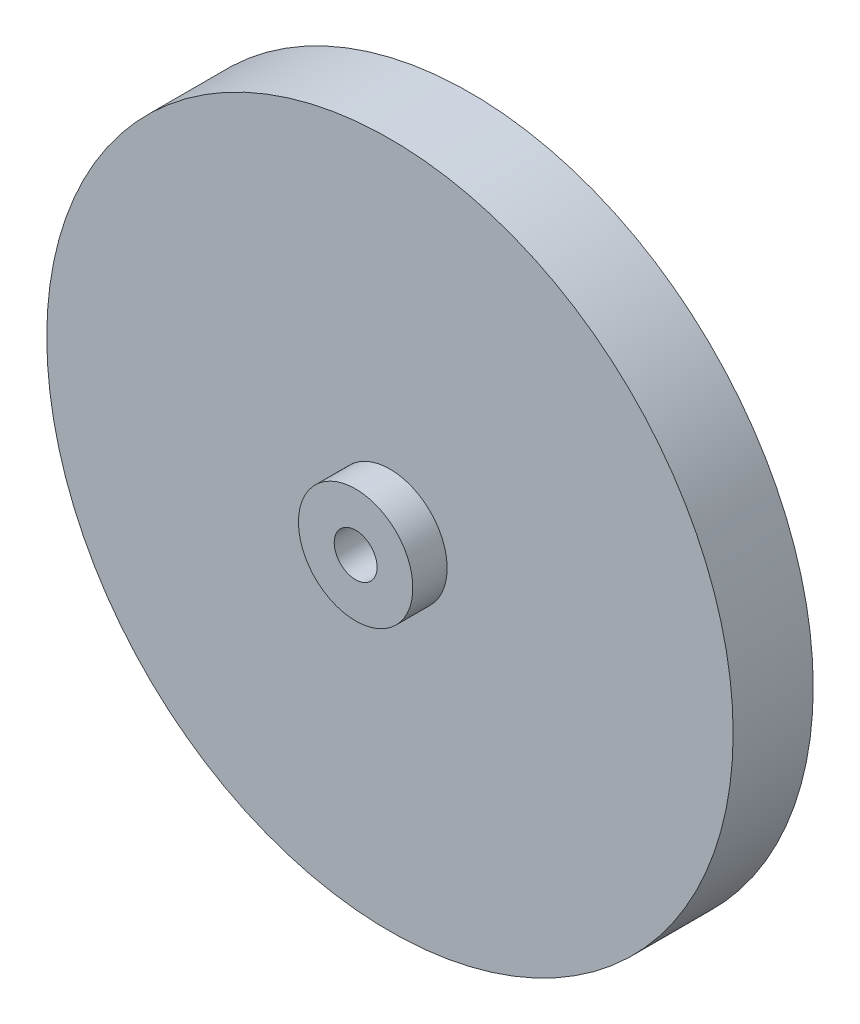
ISO-10303-21;
HEADER;
FILE_DESCRIPTION(('STEP AP214'),'2;1');
FILE_NAME('part.step','',(''),(''),'','','');
FILE_SCHEMA(('AUTOMOTIVE_DESIGN { 1 0 10303 214 1 1 1 1 }'));
ENDSEC;
DATA;
#1=APPLICATION_CONTEXT('core data for automotive mechanical design processes');
#2=APPLICATION_PROTOCOL_DEFINITION('international standard','automotive_design',2000,#1);
#3=PRODUCT_CONTEXT('',#1,'mechanical');
#4=PRODUCT('Part','Part','',(#3));
#5=PRODUCT_RELATED_PRODUCT_CATEGORY('part','',(#4));
#6=PRODUCT_DEFINITION_FORMATION('','',#4);
#7=PRODUCT_DEFINITION_CONTEXT('part definition',#1,'design');
#8=PRODUCT_DEFINITION('design','',#6,#7);
#9=PRODUCT_DEFINITION_SHAPE('','',#8);
#10=(LENGTH_UNIT() NAMED_UNIT(*) SI_UNIT(.MILLI.,.METRE.));
#11=(NAMED_UNIT(*) PLANE_ANGLE_UNIT() SI_UNIT($,.RADIAN.));
#12=(NAMED_UNIT(*) SI_UNIT($,.STERADIAN.) SOLID_ANGLE_UNIT());
#13=UNCERTAINTY_MEASURE_WITH_UNIT(LENGTH_MEASURE(1.E-05),#10,'distance_accuracy_value','');
#14=(GEOMETRIC_REPRESENTATION_CONTEXT(3) GLOBAL_UNCERTAINTY_ASSIGNED_CONTEXT((#13)) GLOBAL_UNIT_ASSIGNED_CONTEXT((#10,
#11,#12)) REPRESENTATION_CONTEXT('',''));
#15=CARTESIAN_POINT('',(0.,0.,0.));
#16=DIRECTION('',(0.,0.,1.));
#17=DIRECTION('',(1.,0.,0.));
#18=AXIS2_PLACEMENT_3D('',#15,#16,#17);
#19=CARTESIAN_POINT('',(0.,0.,-56.2011494252873));
#20=DIRECTION('',(0.,0.,-1.));
#21=DIRECTION('',(-1.,0.,0.));
#22=AXIS2_PLACEMENT_3D('',#19,#20,#21);
#23=CYLINDRICAL_SURFACE('',#22,60.);
#24=CARTESIAN_POINT('',(0.,0.,-26.4948275862069));
#25=DIRECTION('',(0.,0.,-1.));
#26=DIRECTION('',(-1.,0.,0.));
#27=AXIS2_PLACEMENT_3D('',#24,#25,#26);
#28=CIRCLE('',#27,60.);
#29=CARTESIAN_POINT('',(-60.,0.,-26.4948275862069));
#30=VERTEX_POINT('',#29);
#31=EDGE_CURVE('E37',#30,#30,#28,.T.);
#32=ORIENTED_EDGE('',*,*,#31,.T.);
#33=EDGE_LOOP('',(#32));
#34=FACE_BOUND('',#33,.T.);
#35=CARTESIAN_POINT('',(0.,0.,-40.4948275862069));
#36=DIRECTION('',(0.,0.,-1.));
#37=DIRECTION('',(-1.,0.,0.));
#38=AXIS2_PLACEMENT_3D('',#35,#36,#37);
#39=CIRCLE('',#38,60.);
#40=CARTESIAN_POINT('',(-60.,0.,-40.4948275862069));
#41=VERTEX_POINT('',#40);
#42=EDGE_CURVE('E10',#41,#41,#39,.T.);
#43=ORIENTED_EDGE('',*,*,#42,.F.);
#44=EDGE_LOOP('',(#43));
#45=FACE_BOUND('',#44,.T.);
#46=ADVANCED_FACE('F31',(#34,#45),#23,.T.);
#47=CARTESIAN_POINT('',(-60.,0.,-26.4948275862069));
#48=DIRECTION('',(0.,0.,1.));
#49=DIRECTION('',(1.,0.,0.));
#50=AXIS2_PLACEMENT_3D('',#47,#48,#49);
#51=PLANE('',#50);
#52=CARTESIAN_POINT('',(0.,0.,-26.4948275862069));
#53=DIRECTION('',(0.,0.,-1.));
#54=DIRECTION('',(-1.,0.,0.));
#55=AXIS2_PLACEMENT_3D('',#52,#53,#54);
#56=CIRCLE('',#55,10.);
#57=CARTESIAN_POINT('',(-10.,0.,-26.4948275862069));
#58=VERTEX_POINT('',#57);
#59=EDGE_CURVE('E41',#58,#58,#56,.T.);
#60=ORIENTED_EDGE('',*,*,#59,.T.);
#61=EDGE_LOOP('',(#60));
#62=FACE_BOUND('',#61,.T.);
#63=ORIENTED_EDGE('',*,*,#31,.F.);
#64=EDGE_LOOP('',(#63));
#65=FACE_BOUND('',#64,.T.);
#66=ADVANCED_FACE('F69',(#62,#65),#51,.T.);
#67=CARTESIAN_POINT('',(0.,0.,-56.2011494252873));
#68=DIRECTION('',(0.,0.,-1.));
#69=DIRECTION('',(-1.,0.,0.));
#70=AXIS2_PLACEMENT_3D('',#67,#68,#69);
#71=CYLINDRICAL_SURFACE('',#70,9.99999999999999);
#72=CARTESIAN_POINT('',(0.,0.,-20.4948275862069));
#73=DIRECTION('',(0.,0.,-1.));
#74=DIRECTION('',(-1.,0.,0.));
#75=AXIS2_PLACEMENT_3D('',#72,#73,#74);
#76=CIRCLE('',#75,9.99999999999999);
#77=CARTESIAN_POINT('',(-9.99999999999999,0.,-20.4948275862069));
#78=VERTEX_POINT('',#77);
#79=EDGE_CURVE('E45',#78,#78,#76,.T.);
#80=ORIENTED_EDGE('',*,*,#79,.T.);
#81=EDGE_LOOP('',(#80));
#82=FACE_BOUND('',#81,.T.);
#83=ORIENTED_EDGE('',*,*,#59,.F.);
#84=EDGE_LOOP('',(#83));
#85=FACE_BOUND('',#84,.T.);
#86=ADVANCED_FACE('F73',(#82,#85),#71,.T.);
#87=CARTESIAN_POINT('',(-9.99999999999999,0.,-20.4948275862069));
#88=DIRECTION('',(0.,0.,1.));
#89=DIRECTION('',(1.,0.,0.));
#90=AXIS2_PLACEMENT_3D('',#87,#88,#89);
#91=PLANE('',#90);
#92=CARTESIAN_POINT('',(0.,0.,-20.4948275862069));
#93=DIRECTION('',(0.,0.,-1.));
#94=DIRECTION('',(-1.,0.,0.));
#95=AXIS2_PLACEMENT_3D('',#92,#93,#94);
#96=CIRCLE('',#95,3.75);
#97=CARTESIAN_POINT('',(-3.75,0.,-20.4948275862069));
#98=VERTEX_POINT('',#97);
#99=EDGE_CURVE('E50',#98,#98,#96,.T.);
#100=ORIENTED_EDGE('',*,*,#99,.T.);
#101=EDGE_LOOP('',(#100));
#102=FACE_BOUND('',#101,.T.);
#103=ORIENTED_EDGE('',*,*,#79,.F.);
#104=EDGE_LOOP('',(#103));
#105=FACE_BOUND('',#104,.T.);
#106=ADVANCED_FACE('F66',(#102,#105),#91,.T.);
#107=CARTESIAN_POINT('',(0.,0.,-56.2011494252873));
#108=DIRECTION('',(0.,0.,-1.));
#109=DIRECTION('',(-1.,0.,0.));
#110=AXIS2_PLACEMENT_3D('',#107,#108,#109);
#111=CYLINDRICAL_SURFACE('',#110,3.75);
#112=CARTESIAN_POINT('',(0.,0.,-40.4948275862069));
#113=DIRECTION('',(0.,0.,-1.));
#114=DIRECTION('',(-1.,0.,0.));
#115=AXIS2_PLACEMENT_3D('',#112,#113,#114);
#116=CIRCLE('',#115,3.75);
#117=CARTESIAN_POINT('',(-3.75,0.,-40.4948275862069));
#118=VERTEX_POINT('',#117);
#119=EDGE_CURVE('E53',#118,#118,#116,.T.);
#120=ORIENTED_EDGE('',*,*,#119,.T.);
#121=EDGE_LOOP('',(#120));
#122=FACE_BOUND('',#121,.T.);
#123=ORIENTED_EDGE('',*,*,#99,.F.);
#124=EDGE_LOOP('',(#123));
#125=FACE_BOUND('',#124,.T.);
#126=ADVANCED_FACE('F57',(#122,#125),#111,.F.);
#127=CARTESIAN_POINT('',(-3.75,0.,-40.4948275862069));
#128=DIRECTION('',(0.,0.,-1.));
#129=DIRECTION('',(-1.,0.,0.));
#130=AXIS2_PLACEMENT_3D('',#127,#128,#129);
#131=PLANE('',#130);
#132=ORIENTED_EDGE('',*,*,#42,.T.);
#133=EDGE_LOOP('',(#132));
#134=FACE_BOUND('',#133,.T.);
#135=ORIENTED_EDGE('',*,*,#119,.F.);
#136=EDGE_LOOP('',(#135));
#137=FACE_BOUND('',#136,.T.);
#138=ADVANCED_FACE('F60',(#134,#137),#131,.T.);
#139=CLOSED_SHELL('',(#46,#66,#86,#106,#126,#138));
#140=MANIFOLD_SOLID_BREP('B2',#139);
#141=ADVANCED_BREP_SHAPE_REPRESENTATION('',(#18,#140),#14);
#142=SHAPE_DEFINITION_REPRESENTATION(#9,#141);
ENDSEC;
END-ISO-10303-21;
